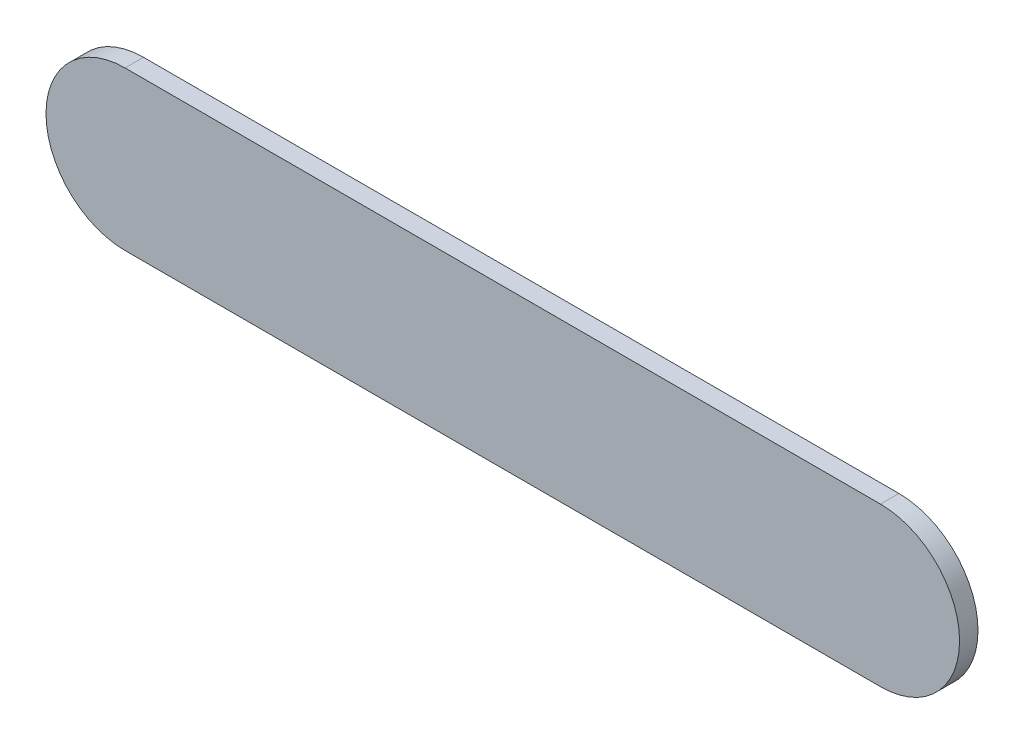
ISO-10303-21;
HEADER;
FILE_DESCRIPTION(('STEP AP214'),'2;1');
FILE_NAME('part.step','',(''),(''),'','','');
FILE_SCHEMA(('AUTOMOTIVE_DESIGN { 1 0 10303 214 1 1 1 1 }'));
ENDSEC;
DATA;
#1=APPLICATION_CONTEXT('core data for automotive mechanical design processes');
#2=APPLICATION_PROTOCOL_DEFINITION('international standard','automotive_design',2000,#1);
#3=PRODUCT_CONTEXT('',#1,'mechanical');
#4=PRODUCT('Part','Part','',(#3));
#5=PRODUCT_RELATED_PRODUCT_CATEGORY('part','',(#4));
#6=PRODUCT_DEFINITION_FORMATION('','',#4);
#7=PRODUCT_DEFINITION_CONTEXT('part definition',#1,'design');
#8=PRODUCT_DEFINITION('design','',#6,#7);
#9=PRODUCT_DEFINITION_SHAPE('','',#8);
#10=(LENGTH_UNIT() NAMED_UNIT(*) SI_UNIT(.MILLI.,.METRE.));
#11=(NAMED_UNIT(*) PLANE_ANGLE_UNIT() SI_UNIT($,.RADIAN.));
#12=(NAMED_UNIT(*) SI_UNIT($,.STERADIAN.) SOLID_ANGLE_UNIT());
#13=UNCERTAINTY_MEASURE_WITH_UNIT(LENGTH_MEASURE(1.E-05),#10,'distance_accuracy_value','');
#14=(GEOMETRIC_REPRESENTATION_CONTEXT(3) GLOBAL_UNCERTAINTY_ASSIGNED_CONTEXT((#13)) GLOBAL_UNIT_ASSIGNED_CONTEXT((#10,
#11,#12)) REPRESENTATION_CONTEXT('',''));
#15=CARTESIAN_POINT('',(0.,0.,0.));
#16=DIRECTION('',(0.,0.,1.));
#17=DIRECTION('',(1.,0.,0.));
#18=AXIS2_PLACEMENT_3D('',#15,#16,#17);
#19=CARTESIAN_POINT('',(110.367,-85.95,1.635));
#20=DIRECTION('',(0.,0.,1.));
#21=DIRECTION('',(1.,0.,0.));
#22=AXIS2_PLACEMENT_3D('',#19,#20,#21);
#23=PLANE('',#22);
#24=DIRECTION('',(1.,0.,0.));
#25=VECTOR('',#24,1.);
#26=CARTESIAN_POINT('',(110.367,-85.95,1.635));
#27=LINE('',#26,#25);
#28=CARTESIAN_POINT('',(110.367,-85.95,1.635));
#29=VERTEX_POINT('',#28);
#30=CARTESIAN_POINT('',(111.8,-85.95,1.635));
#31=VERTEX_POINT('',#30);
#32=EDGE_CURVE('E75',#29,#31,#27,.T.);
#33=ORIENTED_EDGE('',*,*,#32,.T.);
#34=CARTESIAN_POINT('',(111.8,-85.8,1.635));
#35=DIRECTION('',(0.,0.,1.));
#36=DIRECTION('',(0.,-1.,0.));
#37=AXIS2_PLACEMENT_3D('',#34,#35,#36);
#38=CIRCLE('',#37,0.15);
#39=CARTESIAN_POINT('',(111.8,-85.65,1.635));
#40=VERTEX_POINT('',#39);
#41=EDGE_CURVE('E73',#31,#40,#38,.T.);
#42=ORIENTED_EDGE('',*,*,#41,.T.);
#43=DIRECTION('',(-1.,0.,0.));
#44=VECTOR('',#43,1.);
#45=CARTESIAN_POINT('',(111.8,-85.65,1.635));
#46=LINE('',#45,#44);
#47=CARTESIAN_POINT('',(110.367,-85.65,1.635));
#48=VERTEX_POINT('',#47);
#49=EDGE_CURVE('E61',#40,#48,#46,.T.);
#50=ORIENTED_EDGE('',*,*,#49,.T.);
#51=CARTESIAN_POINT('',(110.367,-85.8,1.635));
#52=DIRECTION('',(0.,0.,1.));
#53=DIRECTION('',(0.,1.,0.));
#54=AXIS2_PLACEMENT_3D('',#51,#52,#53);
#55=CIRCLE('',#54,0.15);
#56=EDGE_CURVE('E11',#48,#29,#55,.T.);
#57=ORIENTED_EDGE('',*,*,#56,.T.);
#58=EDGE_LOOP('',(#33,#42,#50,#57));
#59=FACE_BOUND('',#58,.T.);
#60=ADVANCED_FACE('F17',(#59),#23,.T.);
#61=CARTESIAN_POINT('',(110.367,-85.95,1.6));
#62=DIRECTION('',(0.,0.,1.));
#63=DIRECTION('',(1.,0.,0.));
#64=AXIS2_PLACEMENT_3D('',#61,#62,#63);
#65=PLANE('',#64);
#66=CARTESIAN_POINT('',(110.367,-85.8,1.6));
#67=DIRECTION('',(0.,0.,1.));
#68=DIRECTION('',(0.,1.,0.));
#69=AXIS2_PLACEMENT_3D('',#66,#67,#68);
#70=CIRCLE('',#69,0.15);
#71=CARTESIAN_POINT('',(110.367,-85.65,1.6));
#72=VERTEX_POINT('',#71);
#73=CARTESIAN_POINT('',(110.367,-85.95,1.6));
#74=VERTEX_POINT('',#73);
#75=EDGE_CURVE('E27',#72,#74,#70,.T.);
#76=ORIENTED_EDGE('',*,*,#75,.F.);
#77=DIRECTION('',(-1.,0.,0.));
#78=VECTOR('',#77,1.);
#79=CARTESIAN_POINT('',(111.8,-85.65,1.6));
#80=LINE('',#79,#78);
#81=CARTESIAN_POINT('',(111.8,-85.65,1.6));
#82=VERTEX_POINT('',#81);
#83=EDGE_CURVE('E80',#82,#72,#80,.T.);
#84=ORIENTED_EDGE('',*,*,#83,.F.);
#85=CARTESIAN_POINT('',(111.8,-85.8,1.6));
#86=DIRECTION('',(0.,0.,1.));
#87=DIRECTION('',(0.,-1.,0.));
#88=AXIS2_PLACEMENT_3D('',#85,#86,#87);
#89=CIRCLE('',#88,0.15);
#90=CARTESIAN_POINT('',(111.8,-85.95,1.6));
#91=VERTEX_POINT('',#90);
#92=EDGE_CURVE('E84',#91,#82,#89,.T.);
#93=ORIENTED_EDGE('',*,*,#92,.F.);
#94=DIRECTION('',(1.,0.,0.));
#95=VECTOR('',#94,1.);
#96=CARTESIAN_POINT('',(110.367,-85.95,1.6));
#97=LINE('',#96,#95);
#98=EDGE_CURVE('E111',#74,#91,#97,.T.);
#99=ORIENTED_EDGE('',*,*,#98,.F.);
#100=EDGE_LOOP('',(#76,#84,#93,#99));
#101=FACE_BOUND('',#100,.T.);
#102=ADVANCED_FACE('F122',(#101),#65,.F.);
#103=CARTESIAN_POINT('',(110.367,-85.8,1.6));
#104=DIRECTION('',(0.,0.,-1.));
#105=DIRECTION('',(0.,1.,0.));
#106=AXIS2_PLACEMENT_3D('',#103,#104,#105);
#107=CYLINDRICAL_SURFACE('',#106,0.15);
#108=ORIENTED_EDGE('',*,*,#75,.T.);
#109=DIRECTION('',(0.,0.,1.));
#110=VECTOR('',#109,1.);
#111=CARTESIAN_POINT('',(110.367,-85.95,1.6));
#112=LINE('',#111,#110);
#113=EDGE_CURVE('E91',#74,#29,#112,.T.);
#114=ORIENTED_EDGE('',*,*,#113,.T.);
#115=ORIENTED_EDGE('',*,*,#56,.F.);
#116=DIRECTION('',(0.,0.,1.));
#117=VECTOR('',#116,1.);
#118=CARTESIAN_POINT('',(110.367,-85.65,1.6));
#119=LINE('',#118,#117);
#120=EDGE_CURVE('E68',#72,#48,#119,.T.);
#121=ORIENTED_EDGE('',*,*,#120,.F.);
#122=EDGE_LOOP('',(#108,#114,#115,#121));
#123=FACE_BOUND('',#122,.T.);
#124=ADVANCED_FACE('F19',(#123),#107,.T.);
#125=CARTESIAN_POINT('',(111.8,-85.65,1.6));
#126=DIRECTION('',(0.,-1.,0.));
#127=DIRECTION('',(0.,0.,-1.));
#128=AXIS2_PLACEMENT_3D('',#125,#126,#127);
#129=PLANE('',#128);
#130=ORIENTED_EDGE('',*,*,#83,.T.);
#131=ORIENTED_EDGE('',*,*,#120,.T.);
#132=ORIENTED_EDGE('',*,*,#49,.F.);
#133=DIRECTION('',(0.,0.,1.));
#134=VECTOR('',#133,1.);
#135=CARTESIAN_POINT('',(111.8,-85.65,1.6));
#136=LINE('',#135,#134);
#137=EDGE_CURVE('E66',#82,#40,#136,.T.);
#138=ORIENTED_EDGE('',*,*,#137,.F.);
#139=EDGE_LOOP('',(#130,#131,#132,#138));
#140=FACE_BOUND('',#139,.T.);
#141=ADVANCED_FACE('F64',(#140),#129,.F.);
#142=CARTESIAN_POINT('',(111.8,-85.8,1.6));
#143=DIRECTION('',(0.,0.,-1.));
#144=DIRECTION('',(0.,-1.,0.));
#145=AXIS2_PLACEMENT_3D('',#142,#143,#144);
#146=CYLINDRICAL_SURFACE('',#145,0.15);
#147=ORIENTED_EDGE('',*,*,#92,.T.);
#148=ORIENTED_EDGE('',*,*,#137,.T.);
#149=ORIENTED_EDGE('',*,*,#41,.F.);
#150=DIRECTION('',(0.,0.,1.));
#151=VECTOR('',#150,1.);
#152=CARTESIAN_POINT('',(111.8,-85.95,1.6));
#153=LINE('',#152,#151);
#154=EDGE_CURVE('E108',#91,#31,#153,.T.);
#155=ORIENTED_EDGE('',*,*,#154,.F.);
#156=EDGE_LOOP('',(#147,#148,#149,#155));
#157=FACE_BOUND('',#156,.T.);
#158=ADVANCED_FACE('F82',(#157),#146,.T.);
#159=CARTESIAN_POINT('',(110.367,-85.95,1.6));
#160=DIRECTION('',(0.,1.,0.));
#161=DIRECTION('',(1.,0.,0.));
#162=AXIS2_PLACEMENT_3D('',#159,#160,#161);
#163=PLANE('',#162);
#164=ORIENTED_EDGE('',*,*,#98,.T.);
#165=ORIENTED_EDGE('',*,*,#154,.T.);
#166=ORIENTED_EDGE('',*,*,#32,.F.);
#167=ORIENTED_EDGE('',*,*,#113,.F.);
#168=EDGE_LOOP('',(#164,#165,#166,#167));
#169=FACE_BOUND('',#168,.T.);
#170=ADVANCED_FACE('F119',(#169),#163,.F.);
#171=CLOSED_SHELL('',(#60,#102,#124,#141,#158,#170));
#172=MANIFOLD_SOLID_BREP('B1',#171);
#173=ADVANCED_BREP_SHAPE_REPRESENTATION('',(#18,#172),#14);
#174=SHAPE_DEFINITION_REPRESENTATION(#9,#173);
ENDSEC;
END-ISO-10303-21;
